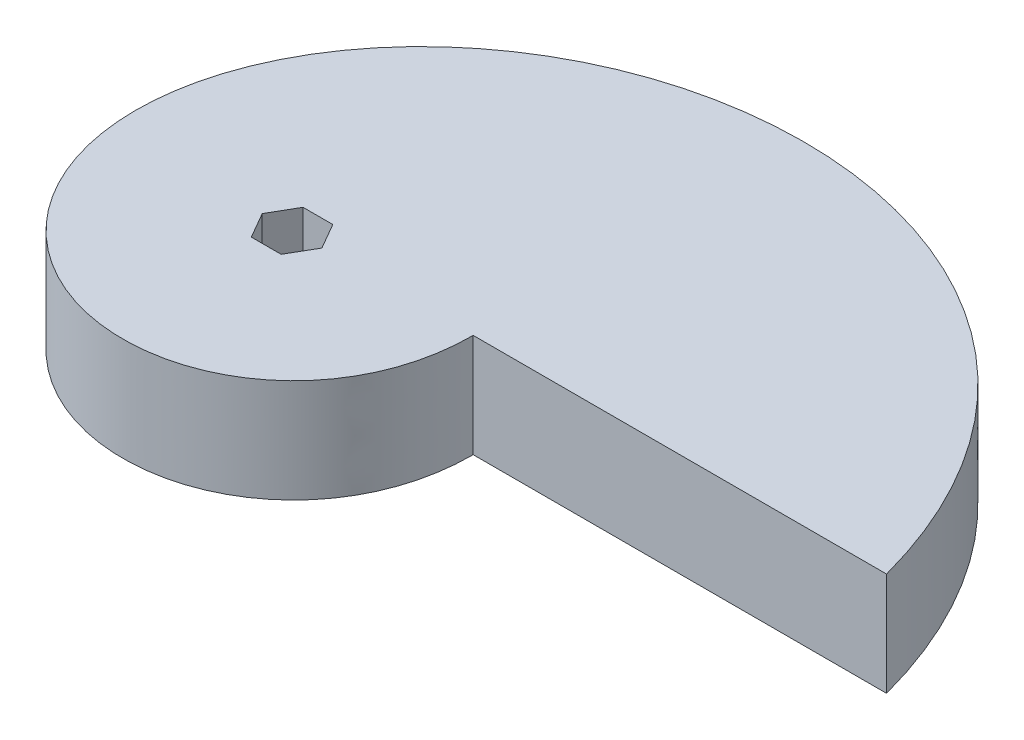
ISO-10303-21;
HEADER;
FILE_DESCRIPTION(('STEP AP214'),'2;1');
FILE_NAME('part.step','',(''),(''),'','','');
FILE_SCHEMA(('AUTOMOTIVE_DESIGN { 1 0 10303 214 1 1 1 1 }'));
ENDSEC;
DATA;
#1=APPLICATION_CONTEXT('core data for automotive mechanical design processes');
#2=APPLICATION_PROTOCOL_DEFINITION('international standard','automotive_design',2000,#1);
#3=PRODUCT_CONTEXT('',#1,'mechanical');
#4=PRODUCT('Part','Part','',(#3));
#5=PRODUCT_RELATED_PRODUCT_CATEGORY('part','',(#4));
#6=PRODUCT_DEFINITION_FORMATION('','',#4);
#7=PRODUCT_DEFINITION_CONTEXT('part definition',#1,'design');
#8=PRODUCT_DEFINITION('design','',#6,#7);
#9=PRODUCT_DEFINITION_SHAPE('','',#8);
#10=(LENGTH_UNIT() NAMED_UNIT(*) SI_UNIT(.MILLI.,.METRE.));
#11=(NAMED_UNIT(*) PLANE_ANGLE_UNIT() SI_UNIT($,.RADIAN.));
#12=(NAMED_UNIT(*) SI_UNIT($,.STERADIAN.) SOLID_ANGLE_UNIT());
#13=UNCERTAINTY_MEASURE_WITH_UNIT(LENGTH_MEASURE(1.E-05),#10,'distance_accuracy_value','');
#14=(GEOMETRIC_REPRESENTATION_CONTEXT(3) GLOBAL_UNCERTAINTY_ASSIGNED_CONTEXT((#13)) GLOBAL_UNIT_ASSIGNED_CONTEXT((#10,
#11,#12)) REPRESENTATION_CONTEXT('',''));
#15=CARTESIAN_POINT('',(0.,0.,0.));
#16=DIRECTION('',(0.,0.,1.));
#17=DIRECTION('',(1.,0.,0.));
#18=AXIS2_PLACEMENT_3D('',#15,#16,#17);
#19=CARTESIAN_POINT('',(-86.1832847995758,25.4,-25.9793825361968));
#20=DIRECTION('',(0.,-1.,0.));
#21=DIRECTION('',(0.,0.,-1.));
#22=AXIS2_PLACEMENT_3D('',#19,#20,#21);
#23=PLANE('',#22);
#24=CARTESIAN_POINT('',(101.6,25.4,0.));
#25=CARTESIAN_POINT('',(68.7299812719794,25.4,-122.672579938712));
#26=CARTESIAN_POINT('',(-83.6700187280207,25.4,-122.672579938712));
#27=CARTESIAN_POINT('',(-143.482991694221,25.4,-34.3378151801828));
#28=CARTESIAN_POINT('',(-127.,25.4,76.2));
#29=CARTESIAN_POINT('',(0.,25.4,76.2));
#30=CARTESIAN_POINT('',(0.,25.4,0.));
#31=B_SPLINE_CURVE_WITH_KNOTS('',6,(#24,#25,#26,#27,#28,#29,#30),.UNSPECIFIED.,.F.,.F.,(7,7),
(0.,1.),.UNSPECIFIED.);
#32=CARTESIAN_POINT('',(101.6,25.4,0.));
#33=VERTEX_POINT('',#32);
#34=CARTESIAN_POINT('',(0.,25.4,0.));
#35=VERTEX_POINT('',#34);
#36=EDGE_CURVE('E153',#33,#35,#31,.T.);
#37=ORIENTED_EDGE('',*,*,#36,.T.);
#38=DIRECTION('',(1.,0.,0.));
#39=VECTOR('',#38,1.);
#40=CARTESIAN_POINT('',(0.,25.4,0.));
#41=LINE('',#40,#39);
#42=EDGE_CURVE('E159',#35,#33,#41,.T.);
#43=ORIENTED_EDGE('',*,*,#42,.T.);
#44=EDGE_LOOP('',(#37,#43));
#45=FACE_BOUND('',#44,.T.);
#46=DIRECTION('',(0.5,0.,-0.866025403784439));
#47=VECTOR('',#46,1.);
#48=CARTESIAN_POINT('',(-40.8553447426155,25.4,6.34999999999999));
#49=LINE('',#48,#47);
#50=CARTESIAN_POINT('',(-40.8553447426155,25.4,6.34999999999999));
#51=VERTEX_POINT('',#50);
#52=CARTESIAN_POINT('',(-37.1891705332614,25.4,0.));
#53=VERTEX_POINT('',#52);
#54=EDGE_CURVE('E103',#51,#53,#49,.T.);
#55=ORIENTED_EDGE('',*,*,#54,.F.);
#56=DIRECTION('',(1.,0.,0.));
#57=VECTOR('',#56,1.);
#58=CARTESIAN_POINT('',(-48.1876931613237,25.4,6.35));
#59=LINE('',#58,#57);
#60=CARTESIAN_POINT('',(-48.1876931613237,25.4,6.34999999999999));
#61=VERTEX_POINT('',#60);
#62=EDGE_CURVE('E132',#61,#51,#59,.T.);
#63=ORIENTED_EDGE('',*,*,#62,.F.);
#64=DIRECTION('',(0.5,0.,0.866025403784438));
#65=VECTOR('',#64,1.);
#66=CARTESIAN_POINT('',(-51.8538673706779,25.4,0.));
#67=LINE('',#66,#65);
#68=CARTESIAN_POINT('',(-51.8538673706779,25.4,0.));
#69=VERTEX_POINT('',#68);
#70=EDGE_CURVE('E130',#69,#61,#67,.T.);
#71=ORIENTED_EDGE('',*,*,#70,.F.);
#72=DIRECTION('',(-0.5,0.,0.866025403784439));
#73=VECTOR('',#72,1.);
#74=CARTESIAN_POINT('',(-48.1876931613237,25.4,-6.34999999999999));
#75=LINE('',#74,#73);
#76=CARTESIAN_POINT('',(-48.1876931613237,25.4,-6.34999999999999));
#77=VERTEX_POINT('',#76);
#78=EDGE_CURVE('E126',#77,#69,#75,.T.);
#79=ORIENTED_EDGE('',*,*,#78,.F.);
#80=DIRECTION('',(-1.,0.,0.));
#81=VECTOR('',#80,1.);
#82=CARTESIAN_POINT('',(-40.8553447426155,25.4,-6.34999999999999));
#83=LINE('',#82,#81);
#84=CARTESIAN_POINT('',(-40.8553447426155,25.4,-6.34999999999999));
#85=VERTEX_POINT('',#84);
#86=EDGE_CURVE('E124',#85,#77,#83,.T.);
#87=ORIENTED_EDGE('',*,*,#86,.F.);
#88=DIRECTION('',(-0.5,0.,-0.866025403784439));
#89=VECTOR('',#88,1.);
#90=CARTESIAN_POINT('',(-37.1891705332614,25.4,0.));
#91=LINE('',#90,#89);
#92=EDGE_CURVE('E111',#53,#85,#91,.T.);
#93=ORIENTED_EDGE('',*,*,#92,.F.);
#94=EDGE_LOOP('',(#55,#63,#71,#79,#87,#93));
#95=FACE_BOUND('',#94,.T.);
#96=ADVANCED_FACE('F37',(#45,#95),#23,.F.);
#97=CARTESIAN_POINT('',(-86.1832847995758,0.,-25.9793825361968));
#98=DIRECTION('',(0.,-1.,0.));
#99=DIRECTION('',(0.,0.,-1.));
#100=AXIS2_PLACEMENT_3D('',#97,#98,#99);
#101=PLANE('',#100);
#102=CARTESIAN_POINT('',(101.6,0.,0.));
#103=CARTESIAN_POINT('',(68.7299812719794,0.,-122.672579938712));
#104=CARTESIAN_POINT('',(-83.6700187280207,0.,-122.672579938712));
#105=CARTESIAN_POINT('',(-143.482991694221,0.,-34.3378151801828));
#106=CARTESIAN_POINT('',(-127.,0.,76.2));
#107=CARTESIAN_POINT('',(0.,0.,76.2));
#108=CARTESIAN_POINT('',(0.,0.,0.));
#109=B_SPLINE_CURVE_WITH_KNOTS('',6,(#102,#103,#104,#105,#106,#107,#108),.UNSPECIFIED.,.F.,.F.,
(7,7),(0.,1.),.UNSPECIFIED.);
#110=CARTESIAN_POINT('',(101.6,0.,0.));
#111=VERTEX_POINT('',#110);
#112=CARTESIAN_POINT('',(0.,0.,0.));
#113=VERTEX_POINT('',#112);
#114=EDGE_CURVE('E119',#111,#113,#109,.T.);
#115=ORIENTED_EDGE('',*,*,#114,.F.);
#116=DIRECTION('',(1.,0.,0.));
#117=VECTOR('',#116,1.);
#118=CARTESIAN_POINT('',(0.,0.,0.));
#119=LINE('',#118,#117);
#120=EDGE_CURVE('E160',#113,#111,#119,.T.);
#121=ORIENTED_EDGE('',*,*,#120,.F.);
#122=EDGE_LOOP('',(#115,#121));
#123=FACE_BOUND('',#122,.T.);
#124=DIRECTION('',(1.,0.,0.));
#125=VECTOR('',#124,1.);
#126=CARTESIAN_POINT('',(-48.1876931613237,0.,6.35));
#127=LINE('',#126,#125);
#128=CARTESIAN_POINT('',(-48.1876931613237,0.,6.35));
#129=VERTEX_POINT('',#128);
#130=CARTESIAN_POINT('',(-40.8553447426155,0.,6.34999999999999));
#131=VERTEX_POINT('',#130);
#132=EDGE_CURVE('E112',#129,#131,#127,.T.);
#133=ORIENTED_EDGE('',*,*,#132,.T.);
#134=DIRECTION('',(0.5,0.,-0.866025403784439));
#135=VECTOR('',#134,1.);
#136=CARTESIAN_POINT('',(-40.8553447426155,0.,6.34999999999999));
#137=LINE('',#136,#135);
#138=CARTESIAN_POINT('',(-37.1891705332614,0.,0.));
#139=VERTEX_POINT('',#138);
#140=EDGE_CURVE('E61',#131,#139,#137,.T.);
#141=ORIENTED_EDGE('',*,*,#140,.T.);
#142=DIRECTION('',(-0.5,0.,-0.866025403784439));
#143=VECTOR('',#142,1.);
#144=CARTESIAN_POINT('',(-37.1891705332614,0.,0.));
#145=LINE('',#144,#143);
#146=CARTESIAN_POINT('',(-40.8553447426155,0.,-6.34999999999999));
#147=VERTEX_POINT('',#146);
#148=EDGE_CURVE('E118',#139,#147,#145,.T.);
#149=ORIENTED_EDGE('',*,*,#148,.T.);
#150=DIRECTION('',(-1.,0.,0.));
#151=VECTOR('',#150,1.);
#152=CARTESIAN_POINT('',(-40.8553447426155,0.,-6.34999999999999));
#153=LINE('',#152,#151);
#154=CARTESIAN_POINT('',(-48.1876931613237,0.,-6.34999999999999));
#155=VERTEX_POINT('',#154);
#156=EDGE_CURVE('E136',#147,#155,#153,.T.);
#157=ORIENTED_EDGE('',*,*,#156,.T.);
#158=DIRECTION('',(-0.5,0.,0.866025403784439));
#159=VECTOR('',#158,1.);
#160=CARTESIAN_POINT('',(-48.1876931613237,0.,-6.34999999999999));
#161=LINE('',#160,#159);
#162=CARTESIAN_POINT('',(-51.8538673706779,0.,0.));
#163=VERTEX_POINT('',#162);
#164=EDGE_CURVE('E139',#155,#163,#161,.T.);
#165=ORIENTED_EDGE('',*,*,#164,.T.);
#166=DIRECTION('',(0.5,0.,0.866025403784438));
#167=VECTOR('',#166,1.);
#168=CARTESIAN_POINT('',(-51.8538673706779,0.,0.));
#169=LINE('',#168,#167);
#170=EDGE_CURVE('E142',#163,#129,#169,.T.);
#171=ORIENTED_EDGE('',*,*,#170,.T.);
#172=EDGE_LOOP('',(#133,#141,#149,#157,#165,#171));
#173=FACE_BOUND('',#172,.T.);
#174=ADVANCED_FACE('F180',(#123,#173),#101,.T.);
#175=DIRECTION('',(0.,-1.,0.));
#176=VECTOR('',#175,1.);
#177=SURFACE_OF_LINEAR_EXTRUSION('',#31,#176);
#178=ORIENTED_EDGE('',*,*,#114,.T.);
#179=DIRECTION('',(0.,-1.,0.));
#180=VECTOR('',#179,1.);
#181=CARTESIAN_POINT('',(0.,25.4,0.));
#182=LINE('',#181,#180);
#183=EDGE_CURVE('E11',#35,#113,#182,.T.);
#184=ORIENTED_EDGE('',*,*,#183,.F.);
#185=ORIENTED_EDGE('',*,*,#36,.F.);
#186=DIRECTION('',(0.,-1.,0.));
#187=VECTOR('',#186,1.);
#188=CARTESIAN_POINT('',(101.6,25.4,0.));
#189=LINE('',#188,#187);
#190=EDGE_CURVE('E46',#33,#111,#189,.T.);
#191=ORIENTED_EDGE('',*,*,#190,.T.);
#192=EDGE_LOOP('',(#178,#184,#185,#191));
#193=FACE_BOUND('',#192,.T.);
#194=ADVANCED_FACE('F39',(#193),#177,.F.);
#195=CARTESIAN_POINT('',(0.,25.4,0.));
#196=DIRECTION('',(0.,0.,-1.));
#197=DIRECTION('',(-1.,0.,0.));
#198=AXIS2_PLACEMENT_3D('',#195,#196,#197);
#199=PLANE('',#198);
#200=ORIENTED_EDGE('',*,*,#120,.T.);
#201=ORIENTED_EDGE('',*,*,#190,.F.);
#202=ORIENTED_EDGE('',*,*,#42,.F.);
#203=ORIENTED_EDGE('',*,*,#183,.T.);
#204=EDGE_LOOP('',(#200,#201,#202,#203));
#205=FACE_BOUND('',#204,.T.);
#206=ADVANCED_FACE('F182',(#205),#199,.F.);
#207=CARTESIAN_POINT('',(-40.8553447426155,25.4,6.34999999999999));
#208=DIRECTION('',(-0.866025403784439,0.,-0.5));
#209=DIRECTION('',(-0.5,0.,0.866025403784439));
#210=AXIS2_PLACEMENT_3D('',#207,#208,#209);
#211=PLANE('',#210);
#212=ORIENTED_EDGE('',*,*,#140,.F.);
#213=DIRECTION('',(0.,-1.,0.));
#214=VECTOR('',#213,1.);
#215=CARTESIAN_POINT('',(-40.8553447426155,25.4,6.34999999999999));
#216=LINE('',#215,#214);
#217=EDGE_CURVE('E107',#51,#131,#216,.T.);
#218=ORIENTED_EDGE('',*,*,#217,.F.);
#219=ORIENTED_EDGE('',*,*,#54,.T.);
#220=DIRECTION('',(0.,-1.,0.));
#221=VECTOR('',#220,1.);
#222=CARTESIAN_POINT('',(-37.1891705332614,25.4,0.));
#223=LINE('',#222,#221);
#224=EDGE_CURVE('E106',#53,#139,#223,.T.);
#225=ORIENTED_EDGE('',*,*,#224,.T.);
#226=EDGE_LOOP('',(#212,#218,#219,#225));
#227=FACE_BOUND('',#226,.T.);
#228=ADVANCED_FACE('F105',(#227),#211,.T.);
#229=CARTESIAN_POINT('',(-37.1891705332614,25.4,0.));
#230=DIRECTION('',(-0.866025403784439,0.,0.5));
#231=DIRECTION('',(0.5,0.,0.866025403784439));
#232=AXIS2_PLACEMENT_3D('',#229,#230,#231);
#233=PLANE('',#232);
#234=ORIENTED_EDGE('',*,*,#148,.F.);
#235=ORIENTED_EDGE('',*,*,#224,.F.);
#236=ORIENTED_EDGE('',*,*,#92,.T.);
#237=DIRECTION('',(0.,-1.,0.));
#238=VECTOR('',#237,1.);
#239=CARTESIAN_POINT('',(-40.8553447426155,25.4,-6.34999999999999));
#240=LINE('',#239,#238);
#241=EDGE_CURVE('E120',#85,#147,#240,.T.);
#242=ORIENTED_EDGE('',*,*,#241,.T.);
#243=EDGE_LOOP('',(#234,#235,#236,#242));
#244=FACE_BOUND('',#243,.T.);
#245=ADVANCED_FACE('F115',(#244),#233,.T.);
#246=CARTESIAN_POINT('',(-40.8553447426155,25.4,-6.34999999999999));
#247=DIRECTION('',(0.,0.,1.));
#248=DIRECTION('',(1.,0.,0.));
#249=AXIS2_PLACEMENT_3D('',#246,#247,#248);
#250=PLANE('',#249);
#251=ORIENTED_EDGE('',*,*,#156,.F.);
#252=ORIENTED_EDGE('',*,*,#241,.F.);
#253=ORIENTED_EDGE('',*,*,#86,.T.);
#254=DIRECTION('',(0.,-1.,0.));
#255=VECTOR('',#254,1.);
#256=CARTESIAN_POINT('',(-48.1876931613237,25.4,-6.34999999999999));
#257=LINE('',#256,#255);
#258=EDGE_CURVE('E151',#77,#155,#257,.T.);
#259=ORIENTED_EDGE('',*,*,#258,.T.);
#260=EDGE_LOOP('',(#251,#252,#253,#259));
#261=FACE_BOUND('',#260,.T.);
#262=ADVANCED_FACE('F235',(#261),#250,.T.);
#263=CARTESIAN_POINT('',(-48.1876931613237,25.4,-6.34999999999999));
#264=DIRECTION('',(0.866025403784439,0.,0.5));
#265=DIRECTION('',(0.5,0.,-0.866025403784439));
#266=AXIS2_PLACEMENT_3D('',#263,#264,#265);
#267=PLANE('',#266);
#268=ORIENTED_EDGE('',*,*,#164,.F.);
#269=ORIENTED_EDGE('',*,*,#258,.F.);
#270=ORIENTED_EDGE('',*,*,#78,.T.);
#271=DIRECTION('',(0.,-1.,0.));
#272=VECTOR('',#271,1.);
#273=CARTESIAN_POINT('',(-51.8538673706779,25.4,0.));
#274=LINE('',#273,#272);
#275=EDGE_CURVE('E149',#69,#163,#274,.T.);
#276=ORIENTED_EDGE('',*,*,#275,.T.);
#277=EDGE_LOOP('',(#268,#269,#270,#276));
#278=FACE_BOUND('',#277,.T.);
#279=ADVANCED_FACE('F243',(#278),#267,.T.);
#280=CARTESIAN_POINT('',(-51.8538673706779,25.4,0.));
#281=DIRECTION('',(0.866025403784438,0.,-0.5));
#282=DIRECTION('',(-0.5,0.,-0.866025403784438));
#283=AXIS2_PLACEMENT_3D('',#280,#281,#282);
#284=PLANE('',#283);
#285=ORIENTED_EDGE('',*,*,#170,.F.);
#286=ORIENTED_EDGE('',*,*,#275,.F.);
#287=ORIENTED_EDGE('',*,*,#70,.T.);
#288=DIRECTION('',(0.,-1.,0.));
#289=VECTOR('',#288,1.);
#290=CARTESIAN_POINT('',(-48.1876931613237,25.4,6.35));
#291=LINE('',#290,#289);
#292=EDGE_CURVE('E53',#61,#129,#291,.T.);
#293=ORIENTED_EDGE('',*,*,#292,.T.);
#294=EDGE_LOOP('',(#285,#286,#287,#293));
#295=FACE_BOUND('',#294,.T.);
#296=ADVANCED_FACE('F253',(#295),#284,.T.);
#297=CARTESIAN_POINT('',(-48.1876931613237,25.4,6.35));
#298=DIRECTION('',(0.,0.,-1.));
#299=DIRECTION('',(-1.,0.,0.));
#300=AXIS2_PLACEMENT_3D('',#297,#298,#299);
#301=PLANE('',#300);
#302=ORIENTED_EDGE('',*,*,#132,.F.);
#303=ORIENTED_EDGE('',*,*,#292,.F.);
#304=ORIENTED_EDGE('',*,*,#62,.T.);
#305=ORIENTED_EDGE('',*,*,#217,.T.);
#306=EDGE_LOOP('',(#302,#303,#304,#305));
#307=FACE_BOUND('',#306,.T.);
#308=ADVANCED_FACE('F263',(#307),#301,.T.);
#309=CLOSED_SHELL('',(#96,#174,#194,#206,#228,#245,#262,#279,#296,#308));
#310=MANIFOLD_SOLID_BREP('B2',#309);
#311=ADVANCED_BREP_SHAPE_REPRESENTATION('',(#18,#310),#14);
#312=SHAPE_DEFINITION_REPRESENTATION(#9,#311);
ENDSEC;
END-ISO-10303-21;
